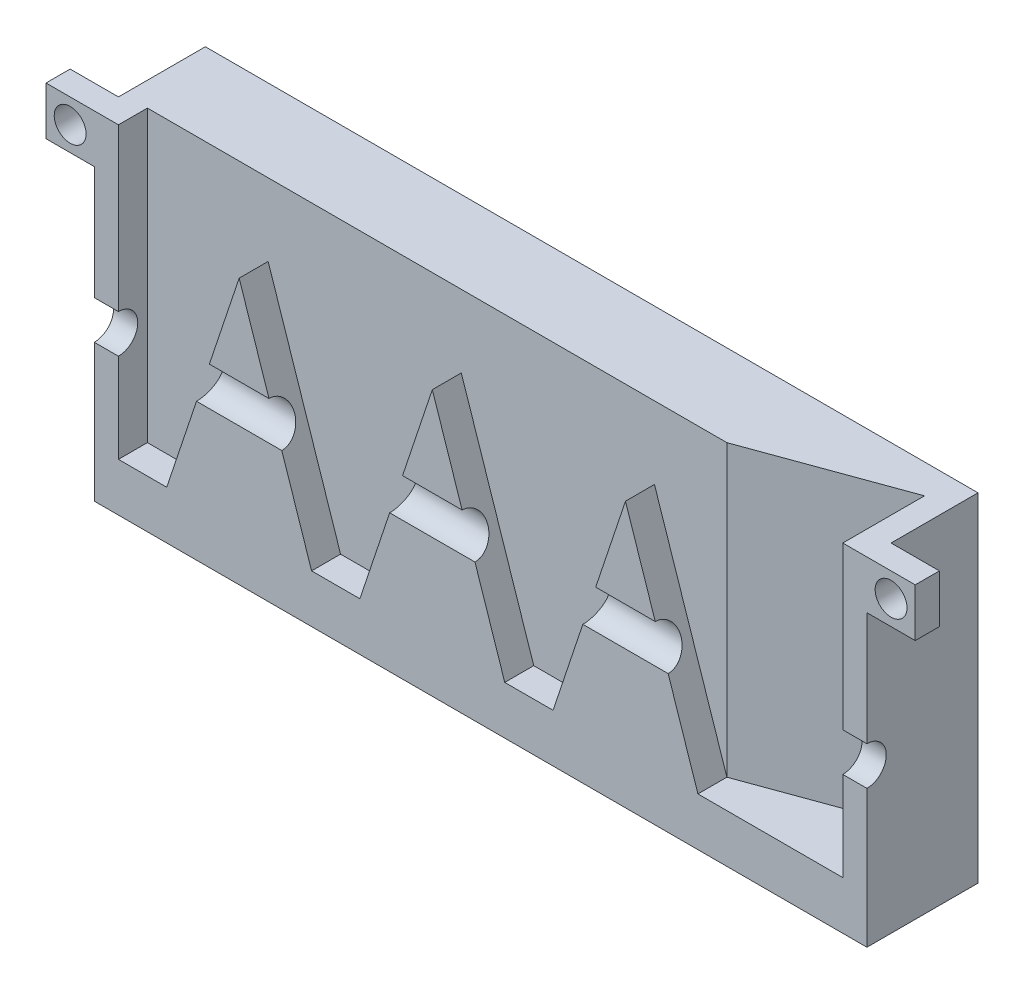
ISO-10303-21;
HEADER;
FILE_DESCRIPTION(('STEP AP214'),'2;1');
FILE_NAME('part.step','',(''),(''),'','','');
FILE_SCHEMA(('AUTOMOTIVE_DESIGN { 1 0 10303 214 1 1 1 1 }'));
ENDSEC;
DATA;
#1=APPLICATION_CONTEXT('core data for automotive mechanical design processes');
#2=APPLICATION_PROTOCOL_DEFINITION('international standard','automotive_design',2000,#1);
#3=PRODUCT_CONTEXT('',#1,'mechanical');
#4=PRODUCT('Part','Part','',(#3));
#5=PRODUCT_RELATED_PRODUCT_CATEGORY('part','',(#4));
#6=PRODUCT_DEFINITION_FORMATION('','',#4);
#7=PRODUCT_DEFINITION_CONTEXT('part definition',#1,'design');
#8=PRODUCT_DEFINITION('design','',#6,#7);
#9=PRODUCT_DEFINITION_SHAPE('','',#8);
#10=(LENGTH_UNIT() NAMED_UNIT(*) SI_UNIT(.MILLI.,.METRE.));
#11=(NAMED_UNIT(*) PLANE_ANGLE_UNIT() SI_UNIT($,.RADIAN.));
#12=(NAMED_UNIT(*) SI_UNIT($,.STERADIAN.) SOLID_ANGLE_UNIT());
#13=UNCERTAINTY_MEASURE_WITH_UNIT(LENGTH_MEASURE(1.E-05),#10,'distance_accuracy_value','');
#14=(GEOMETRIC_REPRESENTATION_CONTEXT(3) GLOBAL_UNCERTAINTY_ASSIGNED_CONTEXT((#13)) GLOBAL_UNIT_ASSIGNED_CONTEXT((#10,
#11,#12)) REPRESENTATION_CONTEXT('',''));
#15=CARTESIAN_POINT('',(0.,0.,0.));
#16=DIRECTION('',(0.,0.,1.));
#17=DIRECTION('',(1.,0.,0.));
#18=AXIS2_PLACEMENT_3D('',#15,#16,#17);
#19=CARTESIAN_POINT('',(0.,0.,63.5515463917525));
#20=DIRECTION('',(0.,0.,-1.));
#21=DIRECTION('',(-1.,0.,0.));
#22=AXIS2_PLACEMENT_3D('',#19,#20,#21);
#23=PLANE('',#22);
#24=DIRECTION('',(0.316227766016838,0.948683298050514,0.));
#25=VECTOR('',#24,1.);
#26=CARTESIAN_POINT('',(-11.6752577319588,5.00000000000001,63.5515463917525));
#27=LINE('',#26,#25);
#28=CARTESIAN_POINT('',(-7.25859106529209,18.25,63.5515463917525));
#29=VERTEX_POINT('',#28);
#30=CARTESIAN_POINT('',(-4.17525773195875,27.5,63.5515463917525));
#31=VERTEX_POINT('',#30);
#32=EDGE_CURVE('E480',#29,#31,#27,.T.);
#33=ORIENTED_EDGE('',*,*,#32,.F.);
#34=DIRECTION('',(-1.,0.,0.));
#35=VECTOR('',#34,1.);
#36=CARTESIAN_POINT('',(45.,18.25,63.5515463917525));
#37=LINE('',#36,#35);
#38=CARTESIAN_POINT('',(-1.09192439862542,18.25,63.5515463917525));
#39=VERTEX_POINT('',#38);
#40=EDGE_CURVE('E452',#29,#39,#37,.F.);
#41=ORIENTED_EDGE('',*,*,#40,.T.);
#42=DIRECTION('',(0.316227766016838,-0.948683298050514,0.));
#43=VECTOR('',#42,1.);
#44=CARTESIAN_POINT('',(-4.17525773195875,27.5,63.5515463917525));
#45=LINE('',#44,#43);
#46=EDGE_CURVE('E466',#31,#39,#45,.T.);
#47=ORIENTED_EDGE('',*,*,#46,.F.);
#48=EDGE_LOOP('',(#33,#41,#47));
#49=FACE_BOUND('',#48,.T.);
#50=ADVANCED_FACE('F32',(#49),#23,.F.);
#51=DIRECTION('',(0.316227766016838,0.948683298050514,0.));
#52=VECTOR('',#51,1.);
#53=CARTESIAN_POINT('',(8.32474226804124,5.00000000000001,63.5515463917525));
#54=LINE('',#53,#52);
#55=CARTESIAN_POINT('',(12.7414089347079,18.25,63.5515463917525));
#56=VERTEX_POINT('',#55);
#57=CARTESIAN_POINT('',(15.8247422680413,27.5,63.5515463917525));
#58=VERTEX_POINT('',#57);
#59=EDGE_CURVE('E455',#56,#58,#54,.T.);
#60=ORIENTED_EDGE('',*,*,#59,.F.);
#61=DIRECTION('',(-1.,0.,0.));
#62=VECTOR('',#61,1.);
#63=CARTESIAN_POINT('',(45.,18.25,63.5515463917525));
#64=LINE('',#63,#62);
#65=CARTESIAN_POINT('',(18.9080756013746,18.25,63.5515463917525));
#66=VERTEX_POINT('',#65);
#67=EDGE_CURVE('E451',#56,#66,#64,.F.);
#68=ORIENTED_EDGE('',*,*,#67,.T.);
#69=DIRECTION('',(0.316227766016838,-0.948683298050514,0.));
#70=VECTOR('',#69,1.);
#71=CARTESIAN_POINT('',(15.8247422680413,27.5,63.5515463917525));
#72=LINE('',#71,#70);
#73=EDGE_CURVE('E436',#58,#66,#72,.T.);
#74=ORIENTED_EDGE('',*,*,#73,.F.);
#75=EDGE_LOOP('',(#60,#68,#74));
#76=FACE_BOUND('',#75,.T.);
#77=ADVANCED_FACE('F654',(#76),#23,.F.);
#78=DIRECTION('',(0.316227766016838,0.948683298050514,0.));
#79=VECTOR('',#78,1.);
#80=CARTESIAN_POINT('',(-31.6752577319588,5.00000000000001,63.5515463917525));
#81=LINE('',#80,#79);
#82=CARTESIAN_POINT('',(-27.2585910652921,18.25,63.5515463917525));
#83=VERTEX_POINT('',#82);
#84=CARTESIAN_POINT('',(-24.1752577319588,27.5,63.5515463917525));
#85=VERTEX_POINT('',#84);
#86=EDGE_CURVE('E438',#83,#85,#81,.T.);
#87=ORIENTED_EDGE('',*,*,#86,.F.);
#88=DIRECTION('',(-1.,0.,0.));
#89=VECTOR('',#88,1.);
#90=CARTESIAN_POINT('',(45.,18.25,63.5515463917525));
#91=LINE('',#90,#89);
#92=CARTESIAN_POINT('',(-21.0919243986254,18.25,63.5515463917525));
#93=VERTEX_POINT('',#92);
#94=EDGE_CURVE('E447',#83,#93,#91,.F.);
#95=ORIENTED_EDGE('',*,*,#94,.T.);
#96=DIRECTION('',(0.316227766016838,-0.948683298050514,0.));
#97=VECTOR('',#96,1.);
#98=CARTESIAN_POINT('',(-24.1752577319588,27.5,63.5515463917525));
#99=LINE('',#98,#97);
#100=EDGE_CURVE('E481',#85,#93,#99,.T.);
#101=ORIENTED_EDGE('',*,*,#100,.F.);
#102=EDGE_LOOP('',(#87,#95,#101));
#103=FACE_BOUND('',#102,.T.);
#104=ADVANCED_FACE('F649',(#103),#23,.F.);
#105=DIRECTION('',(0.,1.,0.));
#106=VECTOR('',#105,1.);
#107=CARTESIAN_POINT('',(-39.1752577319587,35.,63.5515463917525));
#108=LINE('',#107,#106);
#109=CARTESIAN_POINT('',(-39.1752577319587,18.25,63.5515463917525));
#110=VERTEX_POINT('',#109);
#111=CARTESIAN_POINT('',(-39.1752577319587,30.,63.5515463917525));
#112=VERTEX_POINT('',#111);
#113=EDGE_CURVE('E422',#110,#112,#108,.T.);
#114=ORIENTED_EDGE('',*,*,#113,.F.);
#115=DIRECTION('',(-1.,0.,0.));
#116=VECTOR('',#115,1.);
#117=CARTESIAN_POINT('',(45.,18.25,63.5515463917525));
#118=LINE('',#117,#116);
#119=CARTESIAN_POINT('',(-36.6752577319587,18.25,63.5515463917525));
#120=VERTEX_POINT('',#119);
#121=EDGE_CURVE('E414',#110,#120,#118,.F.);
#122=ORIENTED_EDGE('',*,*,#121,.T.);
#123=DIRECTION('',(0.,1.,0.));
#124=VECTOR('',#123,1.);
#125=CARTESIAN_POINT('',(-36.6752577319588,5.00000000000001,63.5515463917525));
#126=LINE('',#125,#124);
#127=CARTESIAN_POINT('',(-36.6752577319588,35.,63.5515463917525));
#128=VERTEX_POINT('',#127);
#129=EDGE_CURVE('E456',#120,#128,#126,.T.);
#130=ORIENTED_EDGE('',*,*,#129,.T.);
#131=DIRECTION('',(1.,0.,0.));
#132=VECTOR('',#131,1.);
#133=CARTESIAN_POINT('',(0.,35.,63.5515463917525));
#134=LINE('',#133,#132);
#135=CARTESIAN_POINT('',(-44.1752577319587,35.,63.5515463917525));
#136=VERTEX_POINT('',#135);
#137=EDGE_CURVE('E420',#136,#128,#134,.T.);
#138=ORIENTED_EDGE('',*,*,#137,.F.);
#139=DIRECTION('',(0.,-1.,0.));
#140=VECTOR('',#139,1.);
#141=CARTESIAN_POINT('',(-44.1752577319587,0.,63.5515463917525));
#142=LINE('',#141,#140);
#143=CARTESIAN_POINT('',(-44.1752577319587,30.,63.5515463917525));
#144=VERTEX_POINT('',#143);
#145=EDGE_CURVE('E432',#136,#144,#142,.T.);
#146=ORIENTED_EDGE('',*,*,#145,.T.);
#147=DIRECTION('',(-1.,0.,0.));
#148=VECTOR('',#147,1.);
#149=CARTESIAN_POINT('',(-44.1752577319587,30.,63.5515463917525));
#150=LINE('',#149,#148);
#151=EDGE_CURVE('E489',#112,#144,#150,.T.);
#152=ORIENTED_EDGE('',*,*,#151,.F.);
#153=EDGE_LOOP('',(#114,#122,#130,#138,#146,#152));
#154=FACE_BOUND('',#153,.T.);
#155=CARTESIAN_POINT('',(-41.6752577319587,32.5,63.5515463917525));
#156=DIRECTION('',(0.,0.,-1.));
#157=DIRECTION('',(-1.,0.,0.));
#158=AXIS2_PLACEMENT_3D('',#155,#156,#157);
#159=CIRCLE('',#158,1.65);
#160=CARTESIAN_POINT('',(-43.3252577319587,32.5,63.5515463917525));
#161=VERTEX_POINT('',#160);
#162=EDGE_CURVE('E36',#161,#161,#159,.F.);
#163=ORIENTED_EDGE('',*,*,#162,.F.);
#164=EDGE_LOOP('',(#163));
#165=FACE_BOUND('',#164,.T.);
#166=ADVANCED_FACE('F629',(#154,#165),#23,.F.);
#167=DIRECTION('',(-1.,0.,0.));
#168=VECTOR('',#167,1.);
#169=CARTESIAN_POINT('',(-36.6752577319588,5.00000000000001,63.5515463917525));
#170=LINE('',#169,#168);
#171=CARTESIAN_POINT('',(-11.6752577319588,5.00000000000001,63.5515463917525));
#172=VERTEX_POINT('',#171);
#173=CARTESIAN_POINT('',(-16.6752577319588,5.00000000000001,63.5515463917525));
#174=VERTEX_POINT('',#173);
#175=EDGE_CURVE('E463',#172,#174,#170,.T.);
#176=ORIENTED_EDGE('',*,*,#175,.T.);
#177=CARTESIAN_POINT('',(-19.7585910652921,14.25,63.5515463917525));
#178=VERTEX_POINT('',#177);
#179=EDGE_CURVE('E471',#178,#174,#99,.T.);
#180=ORIENTED_EDGE('',*,*,#179,.F.);
#181=DIRECTION('',(-1.,0.,0.));
#182=VECTOR('',#181,1.);
#183=CARTESIAN_POINT('',(45.,14.25,63.5515463917525));
#184=LINE('',#183,#182);
#185=CARTESIAN_POINT('',(-28.5919243986254,14.25,63.5515463917525));
#186=VERTEX_POINT('',#185);
#187=EDGE_CURVE('E472',#178,#186,#184,.T.);
#188=ORIENTED_EDGE('',*,*,#187,.T.);
#189=CARTESIAN_POINT('',(-31.6752577319588,5.00000000000001,63.5515463917525));
#190=VERTEX_POINT('',#189);
#191=EDGE_CURVE('E469',#190,#186,#81,.T.);
#192=ORIENTED_EDGE('',*,*,#191,.F.);
#193=DIRECTION('',(-1.,0.,0.));
#194=VECTOR('',#193,1.);
#195=CARTESIAN_POINT('',(-36.6752577319588,5.00000000000001,63.5515463917525));
#196=LINE('',#195,#194);
#197=CARTESIAN_POINT('',(-36.6752577319588,5.00000000000001,63.5515463917525));
#198=VERTEX_POINT('',#197);
#199=EDGE_CURVE('E460',#190,#198,#196,.T.);
#200=ORIENTED_EDGE('',*,*,#199,.T.);
#201=CARTESIAN_POINT('',(-36.6752577319587,14.25,63.5515463917525));
#202=VERTEX_POINT('',#201);
#203=EDGE_CURVE('E459',#198,#202,#126,.T.);
#204=ORIENTED_EDGE('',*,*,#203,.T.);
#205=DIRECTION('',(-1.,0.,0.));
#206=VECTOR('',#205,1.);
#207=CARTESIAN_POINT('',(45.,14.25,63.5515463917525));
#208=LINE('',#207,#206);
#209=CARTESIAN_POINT('',(-39.1752577319587,14.25,63.5515463917525));
#210=VERTEX_POINT('',#209);
#211=EDGE_CURVE('E444',#202,#210,#208,.T.);
#212=ORIENTED_EDGE('',*,*,#211,.T.);
#213=CARTESIAN_POINT('',(-39.1752577319587,0.,63.5515463917525));
#214=VERTEX_POINT('',#213);
#215=EDGE_CURVE('E442',#214,#210,#108,.T.);
#216=ORIENTED_EDGE('',*,*,#215,.F.);
#217=DIRECTION('',(1.,0.,0.));
#218=VECTOR('',#217,1.);
#219=CARTESIAN_POINT('',(0.,0.,63.5515463917525));
#220=LINE('',#219,#218);
#221=CARTESIAN_POINT('',(40.8247422680413,0.,63.5515463917525));
#222=VERTEX_POINT('',#221);
#223=EDGE_CURVE('E424',#214,#222,#220,.T.);
#224=ORIENTED_EDGE('',*,*,#223,.T.);
#225=DIRECTION('',(0.,1.,0.));
#226=VECTOR('',#225,1.);
#227=CARTESIAN_POINT('',(40.8247422680413,35.,63.5515463917525));
#228=LINE('',#227,#226);
#229=CARTESIAN_POINT('',(40.8247422680413,14.25,63.5515463917525));
#230=VERTEX_POINT('',#229);
#231=EDGE_CURVE('E425',#222,#230,#228,.T.);
#232=ORIENTED_EDGE('',*,*,#231,.T.);
#233=DIRECTION('',(-1.,0.,0.));
#234=VECTOR('',#233,1.);
#235=CARTESIAN_POINT('',(45.,14.25,63.5515463917525));
#236=LINE('',#235,#234);
#237=CARTESIAN_POINT('',(38.3247422680412,14.25,63.5515463917525));
#238=VERTEX_POINT('',#237);
#239=EDGE_CURVE('E41',#230,#238,#236,.T.);
#240=ORIENTED_EDGE('',*,*,#239,.T.);
#241=DIRECTION('',(0.,-1.,0.));
#242=VECTOR('',#241,1.);
#243=CARTESIAN_POINT('',(38.3247422680412,5.00000000000001,63.5515463917525));
#244=LINE('',#243,#242);
#245=CARTESIAN_POINT('',(38.3247422680412,5.00000000000001,63.5515463917525));
#246=VERTEX_POINT('',#245);
#247=EDGE_CURVE('E415',#238,#246,#244,.T.);
#248=ORIENTED_EDGE('',*,*,#247,.T.);
#249=DIRECTION('',(-1.,0.,0.));
#250=VECTOR('',#249,1.);
#251=CARTESIAN_POINT('',(-36.6752577319588,5.00000000000001,63.5515463917525));
#252=LINE('',#251,#250);
#253=CARTESIAN_POINT('',(23.3247422680412,5.00000000000001,63.5515463917525));
#254=VERTEX_POINT('',#253);
#255=EDGE_CURVE('E433',#246,#254,#252,.T.);
#256=ORIENTED_EDGE('',*,*,#255,.T.);
#257=CARTESIAN_POINT('',(20.2414089347079,14.25,63.5515463917525));
#258=VERTEX_POINT('',#257);
#259=EDGE_CURVE('E439',#258,#254,#72,.T.);
#260=ORIENTED_EDGE('',*,*,#259,.F.);
#261=DIRECTION('',(-1.,0.,0.));
#262=VECTOR('',#261,1.);
#263=CARTESIAN_POINT('',(45.,14.25,63.5515463917525));
#264=LINE('',#263,#262);
#265=CARTESIAN_POINT('',(11.4080756013746,14.25,63.5515463917525));
#266=VERTEX_POINT('',#265);
#267=EDGE_CURVE('E448',#258,#266,#264,.T.);
#268=ORIENTED_EDGE('',*,*,#267,.T.);
#269=CARTESIAN_POINT('',(8.32474226804124,5.00000000000001,63.5515463917525));
#270=VERTEX_POINT('',#269);
#271=EDGE_CURVE('E453',#270,#266,#54,.T.);
#272=ORIENTED_EDGE('',*,*,#271,.F.);
#273=DIRECTION('',(-1.,0.,0.));
#274=VECTOR('',#273,1.);
#275=CARTESIAN_POINT('',(-36.6752577319588,5.00000000000001,63.5515463917525));
#276=LINE('',#275,#274);
#277=CARTESIAN_POINT('',(3.32474226804125,5.00000000000001,63.5515463917525));
#278=VERTEX_POINT('',#277);
#279=EDGE_CURVE('E418',#270,#278,#276,.T.);
#280=ORIENTED_EDGE('',*,*,#279,.T.);
#281=CARTESIAN_POINT('',(0.241408934707921,14.25,63.5515463917525));
#282=VERTEX_POINT('',#281);
#283=EDGE_CURVE('E468',#282,#278,#45,.T.);
#284=ORIENTED_EDGE('',*,*,#283,.F.);
#285=DIRECTION('',(-1.,0.,0.));
#286=VECTOR('',#285,1.);
#287=CARTESIAN_POINT('',(45.,14.25,63.5515463917525));
#288=LINE('',#287,#286);
#289=CARTESIAN_POINT('',(-8.59192439862543,14.25,63.5515463917525));
#290=VERTEX_POINT('',#289);
#291=EDGE_CURVE('E475',#282,#290,#288,.T.);
#292=ORIENTED_EDGE('',*,*,#291,.T.);
#293=EDGE_CURVE('E478',#172,#290,#27,.T.);
#294=ORIENTED_EDGE('',*,*,#293,.F.);
#295=EDGE_LOOP('',(#176,#180,#188,#192,#200,#204,#212,#216,#224,#232,#240,#248,#256,#260,#268,
#272,#280,#284,#292,#294));
#296=FACE_BOUND('',#295,.T.);
#297=ADVANCED_FACE('F548',(#296),#23,.F.);
#298=CARTESIAN_POINT('',(43.3247422680413,32.5,63.5515463917525));
#299=DIRECTION('',(0.,0.,-1.));
#300=DIRECTION('',(-1.,0.,0.));
#301=AXIS2_PLACEMENT_3D('',#298,#299,#300);
#302=CIRCLE('',#301,1.65);
#303=CARTESIAN_POINT('',(41.6747422680413,32.5,63.5515463917525));
#304=VERTEX_POINT('',#303);
#305=EDGE_CURVE('E428',#304,#304,#302,.T.);
#306=ORIENTED_EDGE('',*,*,#305,.T.);
#307=EDGE_LOOP('',(#306));
#308=FACE_BOUND('',#307,.T.);
#309=DIRECTION('',(1.,0.,0.));
#310=VECTOR('',#309,1.);
#311=CARTESIAN_POINT('',(45.8247422680413,30.,63.5515463917525));
#312=LINE('',#311,#310);
#313=CARTESIAN_POINT('',(40.8247422680413,30.,63.5515463917525));
#314=VERTEX_POINT('',#313);
#315=CARTESIAN_POINT('',(45.8247422680413,30.,63.5515463917525));
#316=VERTEX_POINT('',#315);
#317=EDGE_CURVE('E429',#314,#316,#312,.T.);
#318=ORIENTED_EDGE('',*,*,#317,.T.);
#319=DIRECTION('',(0.,1.,0.));
#320=VECTOR('',#319,1.);
#321=CARTESIAN_POINT('',(45.8247422680413,0.,63.5515463917525));
#322=LINE('',#321,#320);
#323=CARTESIAN_POINT('',(45.8247422680413,35.,63.5515463917525));
#324=VERTEX_POINT('',#323);
#325=EDGE_CURVE('E426',#316,#324,#322,.T.);
#326=ORIENTED_EDGE('',*,*,#325,.T.);
#327=CARTESIAN_POINT('',(38.3247422680412,35.,63.5515463917525));
#328=VERTEX_POINT('',#327);
#329=EDGE_CURVE('E261',#328,#324,#134,.T.);
#330=ORIENTED_EDGE('',*,*,#329,.F.);
#331=CARTESIAN_POINT('',(38.3247422680412,18.25,63.5515463917525));
#332=VERTEX_POINT('',#331);
#333=EDGE_CURVE('E419',#328,#332,#244,.T.);
#334=ORIENTED_EDGE('',*,*,#333,.T.);
#335=DIRECTION('',(-1.,0.,0.));
#336=VECTOR('',#335,1.);
#337=CARTESIAN_POINT('',(45.,18.25,63.5515463917525));
#338=LINE('',#337,#336);
#339=CARTESIAN_POINT('',(40.8247422680413,18.25,63.5515463917525));
#340=VERTEX_POINT('',#339);
#341=EDGE_CURVE('E11',#332,#340,#338,.F.);
#342=ORIENTED_EDGE('',*,*,#341,.T.);
#343=EDGE_CURVE('E56',#340,#314,#228,.T.);
#344=ORIENTED_EDGE('',*,*,#343,.T.);
#345=EDGE_LOOP('',(#318,#326,#330,#334,#342,#344));
#346=FACE_BOUND('',#345,.T.);
#347=ADVANCED_FACE('F34',(#308,#346),#23,.F.);
#348=CARTESIAN_POINT('',(40.8247422680413,35.,52.0515463917525));
#349=DIRECTION('',(1.,0.,0.));
#350=DIRECTION('',(0.,0.,-1.));
#351=AXIS2_PLACEMENT_3D('',#348,#349,#350);
#352=PLANE('',#351);
#353=ORIENTED_EDGE('',*,*,#231,.F.);
#354=DIRECTION('',(0.,0.,1.));
#355=VECTOR('',#354,1.);
#356=CARTESIAN_POINT('',(40.8247422680413,0.,52.0515463917525));
#357=LINE('',#356,#355);
#358=CARTESIAN_POINT('',(40.8247422680413,0.,52.0515463917525));
#359=VERTEX_POINT('',#358);
#360=EDGE_CURVE('E401',#359,#222,#357,.T.);
#361=ORIENTED_EDGE('',*,*,#360,.F.);
#362=DIRECTION('',(0.,-1.,0.));
#363=VECTOR('',#362,1.);
#364=CARTESIAN_POINT('',(40.8247422680413,35.,52.0515463917525));
#365=LINE('',#364,#363);
#366=CARTESIAN_POINT('',(40.8247422680413,35.,52.0515463917525));
#367=VERTEX_POINT('',#366);
#368=EDGE_CURVE('E398',#367,#359,#365,.T.);
#369=ORIENTED_EDGE('',*,*,#368,.F.);
#370=DIRECTION('',(0.,0.,1.));
#371=VECTOR('',#370,1.);
#372=CARTESIAN_POINT('',(40.8247422680413,35.,52.0515463917525));
#373=LINE('',#372,#371);
#374=CARTESIAN_POINT('',(40.8247422680413,35.,61.0515463917525));
#375=VERTEX_POINT('',#374);
#376=EDGE_CURVE('E392',#367,#375,#373,.T.);
#377=ORIENTED_EDGE('',*,*,#376,.T.);
#378=DIRECTION('',(0.,-1.,0.));
#379=VECTOR('',#378,1.);
#380=CARTESIAN_POINT('',(40.8247422680413,35.,61.0515463917525));
#381=LINE('',#380,#379);
#382=CARTESIAN_POINT('',(40.8247422680413,30.,61.0515463917525));
#383=VERTEX_POINT('',#382);
#384=EDGE_CURVE('E273',#375,#383,#381,.T.);
#385=ORIENTED_EDGE('',*,*,#384,.T.);
#386=DIRECTION('',(0.,0.,1.));
#387=VECTOR('',#386,1.);
#388=CARTESIAN_POINT('',(40.8247422680413,30.,61.0515463917525));
#389=LINE('',#388,#387);
#390=EDGE_CURVE('E280',#383,#314,#389,.T.);
#391=ORIENTED_EDGE('',*,*,#390,.T.);
#392=ORIENTED_EDGE('',*,*,#343,.F.);
#393=CARTESIAN_POINT('',(40.8247422680413,16.25,63.5515463917525));
#394=DIRECTION('',(1.,0.,0.));
#395=DIRECTION('',(0.,0.,-1.));
#396=AXIS2_PLACEMENT_3D('',#393,#394,#395);
#397=CIRCLE('',#396,2.);
#398=EDGE_CURVE('E509',#340,#230,#397,.F.);
#399=ORIENTED_EDGE('',*,*,#398,.T.);
#400=EDGE_LOOP('',(#353,#361,#369,#377,#385,#391,#392,#399));
#401=FACE_BOUND('',#400,.T.);
#402=ADVANCED_FACE('F600',(#401),#352,.T.);
#403=CARTESIAN_POINT('',(-39.1752577319587,35.,52.0515463917525));
#404=DIRECTION('',(1.,0.,0.));
#405=DIRECTION('',(0.,0.,-1.));
#406=AXIS2_PLACEMENT_3D('',#403,#404,#405);
#407=PLANE('',#406);
#408=DIRECTION('',(0.,0.,1.));
#409=VECTOR('',#408,1.);
#410=CARTESIAN_POINT('',(-39.1752577319587,0.,52.0515463917525));
#411=LINE('',#410,#409);
#412=CARTESIAN_POINT('',(-39.1752577319587,0.,52.0515463917525));
#413=VERTEX_POINT('',#412);
#414=EDGE_CURVE('E393',#413,#214,#411,.T.);
#415=ORIENTED_EDGE('',*,*,#414,.T.);
#416=ORIENTED_EDGE('',*,*,#215,.T.);
#417=CARTESIAN_POINT('',(-39.1752577319587,16.25,63.5515463917525));
#418=DIRECTION('',(1.,0.,0.));
#419=DIRECTION('',(0.,0.,-1.));
#420=AXIS2_PLACEMENT_3D('',#417,#418,#419);
#421=CIRCLE('',#420,2.);
#422=EDGE_CURVE('E510',#110,#210,#421,.F.);
#423=ORIENTED_EDGE('',*,*,#422,.F.);
#424=ORIENTED_EDGE('',*,*,#113,.T.);
#425=DIRECTION('',(0.,0.,1.));
#426=VECTOR('',#425,1.);
#427=CARTESIAN_POINT('',(-39.1752577319587,30.,61.0515463917525));
#428=LINE('',#427,#426);
#429=CARTESIAN_POINT('',(-39.1752577319587,30.,61.0515463917525));
#430=VERTEX_POINT('',#429);
#431=EDGE_CURVE('E297',#430,#112,#428,.T.);
#432=ORIENTED_EDGE('',*,*,#431,.F.);
#433=DIRECTION('',(0.,-1.,0.));
#434=VECTOR('',#433,1.);
#435=CARTESIAN_POINT('',(-39.1752577319587,35.,61.0515463917525));
#436=LINE('',#435,#434);
#437=CARTESIAN_POINT('',(-39.1752577319587,35.,61.0515463917525));
#438=VERTEX_POINT('',#437);
#439=EDGE_CURVE('E292',#438,#430,#436,.T.);
#440=ORIENTED_EDGE('',*,*,#439,.F.);
#441=DIRECTION('',(0.,0.,1.));
#442=VECTOR('',#441,1.);
#443=CARTESIAN_POINT('',(-39.1752577319587,35.,52.0515463917525));
#444=LINE('',#443,#442);
#445=CARTESIAN_POINT('',(-39.1752577319587,35.,52.0515463917525));
#446=VERTEX_POINT('',#445);
#447=EDGE_CURVE('E395',#446,#438,#444,.T.);
#448=ORIENTED_EDGE('',*,*,#447,.F.);
#449=DIRECTION('',(0.,-1.,0.));
#450=VECTOR('',#449,1.);
#451=CARTESIAN_POINT('',(-39.1752577319587,35.,52.0515463917525));
#452=LINE('',#451,#450);
#453=EDGE_CURVE('E406',#446,#413,#452,.T.);
#454=ORIENTED_EDGE('',*,*,#453,.T.);
#455=EDGE_LOOP('',(#415,#416,#423,#424,#432,#440,#448,#454));
#456=FACE_BOUND('',#455,.T.);
#457=ADVANCED_FACE('F591',(#456),#407,.F.);
#458=CARTESIAN_POINT('',(-39.1752577319587,35.,52.0515463917525));
#459=DIRECTION('',(0.,0.,-1.));
#460=DIRECTION('',(-1.,0.,0.));
#461=AXIS2_PLACEMENT_3D('',#458,#459,#460);
#462=PLANE('',#461);
#463=DIRECTION('',(1.,0.,0.));
#464=VECTOR('',#463,1.);
#465=CARTESIAN_POINT('',(-39.1752577319587,0.,52.0515463917525));
#466=LINE('',#465,#464);
#467=EDGE_CURVE('E388',#413,#359,#466,.T.);
#468=ORIENTED_EDGE('',*,*,#467,.F.);
#469=ORIENTED_EDGE('',*,*,#453,.F.);
#470=DIRECTION('',(1.,0.,0.));
#471=VECTOR('',#470,1.);
#472=CARTESIAN_POINT('',(-39.1752577319587,35.,52.0515463917525));
#473=LINE('',#472,#471);
#474=EDGE_CURVE('E389',#446,#367,#473,.T.);
#475=ORIENTED_EDGE('',*,*,#474,.T.);
#476=ORIENTED_EDGE('',*,*,#368,.T.);
#477=EDGE_LOOP('',(#468,#469,#475,#476));
#478=FACE_BOUND('',#477,.T.);
#479=ADVANCED_FACE('F597',(#478),#462,.T.);
#480=CARTESIAN_POINT('',(0.,35.,0.));
#481=DIRECTION('',(0.,-1.,0.));
#482=DIRECTION('',(0.,0.,-1.));
#483=AXIS2_PLACEMENT_3D('',#480,#481,#482);
#484=PLANE('',#483);
#485=DIRECTION('',(0.,0.,-1.));
#486=VECTOR('',#485,1.);
#487=CARTESIAN_POINT('',(-44.1752577319587,35.,61.0515463917525));
#488=LINE('',#487,#486);
#489=CARTESIAN_POINT('',(-44.1752577319587,35.,61.0515463917525));
#490=VERTEX_POINT('',#489);
#491=EDGE_CURVE('E300',#136,#490,#488,.T.);
#492=ORIENTED_EDGE('',*,*,#491,.F.);
#493=ORIENTED_EDGE('',*,*,#137,.T.);
#494=DIRECTION('',(0.,0.,1.));
#495=VECTOR('',#494,1.);
#496=CARTESIAN_POINT('',(-36.6752577319588,35.,60.5515463917525));
#497=LINE('',#496,#495);
#498=CARTESIAN_POINT('',(-36.6752577319588,35.,60.5515463917525));
#499=VERTEX_POINT('',#498);
#500=EDGE_CURVE('E382',#499,#128,#497,.T.);
#501=ORIENTED_EDGE('',*,*,#500,.F.);
#502=DIRECTION('',(1.,0.,0.));
#503=VECTOR('',#502,1.);
#504=CARTESIAN_POINT('',(-36.6752577319588,35.,60.5515463917525));
#505=LINE('',#504,#503);
#506=CARTESIAN_POINT('',(23.3247422680413,35.,60.5515463917525));
#507=VERTEX_POINT('',#506);
#508=EDGE_CURVE('E374',#499,#507,#505,.T.);
#509=ORIENTED_EDGE('',*,*,#508,.T.);
#510=DIRECTION('',(0.93969262078591,0.,-0.342020143325663));
#511=VECTOR('',#510,1.);
#512=CARTESIAN_POINT('',(23.3247422680413,35.,60.5515463917525));
#513=LINE('',#512,#511);
#514=CARTESIAN_POINT('',(38.3247422680412,35.,55.0919928777596));
#515=VERTEX_POINT('',#514);
#516=EDGE_CURVE('E320',#507,#515,#513,.T.);
#517=ORIENTED_EDGE('',*,*,#516,.T.);
#518=DIRECTION('',(0.,0.,1.));
#519=VECTOR('',#518,1.);
#520=CARTESIAN_POINT('',(38.3247422680412,35.,60.5515463917525));
#521=LINE('',#520,#519);
#522=EDGE_CURVE('E380',#515,#328,#521,.T.);
#523=ORIENTED_EDGE('',*,*,#522,.T.);
#524=ORIENTED_EDGE('',*,*,#329,.T.);
#525=DIRECTION('',(0.,0.,-1.));
#526=VECTOR('',#525,1.);
#527=CARTESIAN_POINT('',(45.8247422680413,35.,61.0515463917525));
#528=LINE('',#527,#526);
#529=CARTESIAN_POINT('',(45.8247422680413,35.,61.0515463917525));
#530=VERTEX_POINT('',#529);
#531=EDGE_CURVE('E252',#324,#530,#528,.T.);
#532=ORIENTED_EDGE('',*,*,#531,.T.);
#533=DIRECTION('',(-1.,0.,0.));
#534=VECTOR('',#533,1.);
#535=CARTESIAN_POINT('',(45.8247422680413,35.,61.0515463917525));
#536=LINE('',#535,#534);
#537=EDGE_CURVE('E257',#530,#375,#536,.T.);
#538=ORIENTED_EDGE('',*,*,#537,.T.);
#539=ORIENTED_EDGE('',*,*,#376,.F.);
#540=ORIENTED_EDGE('',*,*,#474,.F.);
#541=ORIENTED_EDGE('',*,*,#447,.T.);
#542=DIRECTION('',(1.,0.,0.));
#543=VECTOR('',#542,1.);
#544=CARTESIAN_POINT('',(-44.1752577319587,35.,61.0515463917525));
#545=LINE('',#544,#543);
#546=EDGE_CURVE('E302',#490,#438,#545,.T.);
#547=ORIENTED_EDGE('',*,*,#546,.F.);
#548=EDGE_LOOP('',(#492,#493,#501,#509,#517,#523,#524,#532,#538,#539,#540,#541,#547));
#549=FACE_BOUND('',#548,.T.);
#550=ADVANCED_FACE('F255',(#549),#484,.F.);
#551=CARTESIAN_POINT('',(0.,0.,0.));
#552=DIRECTION('',(0.,-1.,0.));
#553=DIRECTION('',(0.,0.,-1.));
#554=AXIS2_PLACEMENT_3D('',#551,#552,#553);
#555=PLANE('',#554);
#556=ORIENTED_EDGE('',*,*,#223,.F.);
#557=ORIENTED_EDGE('',*,*,#414,.F.);
#558=ORIENTED_EDGE('',*,*,#467,.T.);
#559=ORIENTED_EDGE('',*,*,#360,.T.);
#560=EDGE_LOOP('',(#556,#557,#558,#559));
#561=FACE_BOUND('',#560,.T.);
#562=ADVANCED_FACE('F595',(#561),#555,.T.);
#563=CARTESIAN_POINT('',(-36.6752577319588,5.00000000000001,60.5515463917525));
#564=DIRECTION('',(0.,1.,0.));
#565=DIRECTION('',(1.,0.,0.));
#566=AXIS2_PLACEMENT_3D('',#563,#564,#565);
#567=PLANE('',#566);
#568=ORIENTED_EDGE('',*,*,#255,.F.);
#569=DIRECTION('',(0.,0.,1.));
#570=VECTOR('',#569,1.);
#571=CARTESIAN_POINT('',(38.3247422680412,5.00000000000001,60.5515463917525));
#572=LINE('',#571,#570);
#573=CARTESIAN_POINT('',(38.3247422680412,5.00000000000001,55.0919928777596));
#574=VERTEX_POINT('',#573);
#575=EDGE_CURVE('E377',#574,#246,#572,.T.);
#576=ORIENTED_EDGE('',*,*,#575,.F.);
#577=DIRECTION('',(-0.93969262078591,0.,0.342020143325663));
#578=VECTOR('',#577,1.);
#579=CARTESIAN_POINT('',(23.3247422680413,5.00000000000001,60.5515463917525));
#580=LINE('',#579,#578);
#581=CARTESIAN_POINT('',(23.3247422680413,5.00000000000001,60.5515463917525));
#582=VERTEX_POINT('',#581);
#583=EDGE_CURVE('E312',#574,#582,#580,.T.);
#584=ORIENTED_EDGE('',*,*,#583,.T.);
#585=DIRECTION('',(0.,0.,1.));
#586=VECTOR('',#585,1.);
#587=CARTESIAN_POINT('',(23.3247422680412,5.00000000000001,33.5099118257726));
#588=LINE('',#587,#586);
#589=EDGE_CURVE('E323',#582,#254,#588,.T.);
#590=ORIENTED_EDGE('',*,*,#589,.T.);
#591=EDGE_LOOP('',(#568,#576,#584,#590));
#592=FACE_BOUND('',#591,.T.);
#593=ADVANCED_FACE('F608',(#592),#567,.T.);
#594=CARTESIAN_POINT('',(38.3247422680412,5.00000000000001,60.5515463917525));
#595=DIRECTION('',(-1.,0.,0.));
#596=DIRECTION('',(0.,1.,0.));
#597=AXIS2_PLACEMENT_3D('',#594,#595,#596);
#598=PLANE('',#597);
#599=ORIENTED_EDGE('',*,*,#333,.F.);
#600=ORIENTED_EDGE('',*,*,#522,.F.);
#601=DIRECTION('',(0.,-1.,0.));
#602=VECTOR('',#601,1.);
#603=CARTESIAN_POINT('',(38.3247422680412,50.9626665871387,55.0919928777596));
#604=LINE('',#603,#602);
#605=EDGE_CURVE('E317',#515,#574,#604,.T.);
#606=ORIENTED_EDGE('',*,*,#605,.T.);
#607=ORIENTED_EDGE('',*,*,#575,.T.);
#608=ORIENTED_EDGE('',*,*,#247,.F.);
#609=CARTESIAN_POINT('',(38.3247422680412,16.25,63.5515463917525));
#610=DIRECTION('',(-1.,0.,0.));
#611=DIRECTION('',(0.,0.,1.));
#612=AXIS2_PLACEMENT_3D('',#609,#610,#611);
#613=CIRCLE('',#612,2.);
#614=EDGE_CURVE('E512',#238,#332,#613,.F.);
#615=ORIENTED_EDGE('',*,*,#614,.T.);
#616=EDGE_LOOP('',(#599,#600,#606,#607,#608,#615));
#617=FACE_BOUND('',#616,.T.);
#618=ADVANCED_FACE('F604',(#617),#598,.T.);
#619=ORIENTED_EDGE('',*,*,#279,.F.);
#620=DIRECTION('',(0.,0.,1.));
#621=VECTOR('',#620,1.);
#622=CARTESIAN_POINT('',(8.32474226804124,5.00000000000001,33.5099118257726));
#623=LINE('',#622,#621);
#624=CARTESIAN_POINT('',(8.32474226804124,5.00000000000001,60.5515463917525));
#625=VERTEX_POINT('',#624);
#626=EDGE_CURVE('E349',#625,#270,#623,.T.);
#627=ORIENTED_EDGE('',*,*,#626,.F.);
#628=DIRECTION('',(-1.,0.,0.));
#629=VECTOR('',#628,1.);
#630=CARTESIAN_POINT('',(-36.6752577319588,5.00000000000001,60.5515463917525));
#631=LINE('',#630,#629);
#632=CARTESIAN_POINT('',(3.32474226804125,5.00000000000001,60.5515463917525));
#633=VERTEX_POINT('',#632);
#634=EDGE_CURVE('E371',#625,#633,#631,.T.);
#635=ORIENTED_EDGE('',*,*,#634,.T.);
#636=DIRECTION('',(0.,0.,1.));
#637=VECTOR('',#636,1.);
#638=CARTESIAN_POINT('',(3.32474226804125,5.00000000000001,33.5099118257726));
#639=LINE('',#638,#637);
#640=EDGE_CURVE('E329',#633,#278,#639,.T.);
#641=ORIENTED_EDGE('',*,*,#640,.T.);
#642=EDGE_LOOP('',(#619,#627,#635,#641));
#643=FACE_BOUND('',#642,.T.);
#644=ADVANCED_FACE('F552',(#643),#567,.T.);
#645=ORIENTED_EDGE('',*,*,#175,.F.);
#646=DIRECTION('',(0.,0.,1.));
#647=VECTOR('',#646,1.);
#648=CARTESIAN_POINT('',(-11.6752577319588,5.00000000000001,33.5099118257726));
#649=LINE('',#648,#647);
#650=CARTESIAN_POINT('',(-11.6752577319588,5.00000000000001,60.5515463917525));
#651=VERTEX_POINT('',#650);
#652=EDGE_CURVE('E336',#651,#172,#649,.T.);
#653=ORIENTED_EDGE('',*,*,#652,.F.);
#654=CARTESIAN_POINT('',(-16.6752577319588,5.00000000000001,60.5515463917525));
#655=VERTEX_POINT('',#654);
#656=EDGE_CURVE('E369',#651,#655,#631,.T.);
#657=ORIENTED_EDGE('',*,*,#656,.T.);
#658=DIRECTION('',(0.,0.,1.));
#659=VECTOR('',#658,1.);
#660=CARTESIAN_POINT('',(-16.6752577319588,5.00000000000001,33.5099118257726));
#661=LINE('',#660,#659);
#662=EDGE_CURVE('E327',#655,#174,#661,.T.);
#663=ORIENTED_EDGE('',*,*,#662,.T.);
#664=EDGE_LOOP('',(#645,#653,#657,#663));
#665=FACE_BOUND('',#664,.T.);
#666=ADVANCED_FACE('F561',(#665),#567,.T.);
#667=CARTESIAN_POINT('',(-36.6752577319588,5.00000000000001,60.5515463917525));
#668=DIRECTION('',(0.,0.,1.));
#669=DIRECTION('',(1.,0.,0.));
#670=AXIS2_PLACEMENT_3D('',#667,#668,#669);
#671=PLANE('',#670);
#672=ORIENTED_EDGE('',*,*,#508,.F.);
#673=DIRECTION('',(0.,1.,0.));
#674=VECTOR('',#673,1.);
#675=CARTESIAN_POINT('',(-36.6752577319588,5.00000000000001,60.5515463917525));
#676=LINE('',#675,#674);
#677=CARTESIAN_POINT('',(-36.6752577319588,5.00000000000001,60.5515463917525));
#678=VERTEX_POINT('',#677);
#679=EDGE_CURVE('E372',#678,#499,#676,.T.);
#680=ORIENTED_EDGE('',*,*,#679,.F.);
#681=CARTESIAN_POINT('',(-31.6752577319588,5.00000000000001,60.5515463917525));
#682=VERTEX_POINT('',#681);
#683=EDGE_CURVE('E357',#682,#678,#631,.T.);
#684=ORIENTED_EDGE('',*,*,#683,.F.);
#685=DIRECTION('',(-0.316227766016838,-0.948683298050514,0.));
#686=VECTOR('',#685,1.);
#687=CARTESIAN_POINT('',(-31.6752577319588,5.00000000000001,60.5515463917525));
#688=LINE('',#687,#686);
#689=CARTESIAN_POINT('',(-24.1752577319588,27.5,60.5515463917525));
#690=VERTEX_POINT('',#689);
#691=EDGE_CURVE('E354',#690,#682,#688,.T.);
#692=ORIENTED_EDGE('',*,*,#691,.F.);
#693=DIRECTION('',(-0.316227766016838,0.948683298050514,0.));
#694=VECTOR('',#693,1.);
#695=CARTESIAN_POINT('',(-24.1752577319588,27.5,60.5515463917525));
#696=LINE('',#695,#694);
#697=EDGE_CURVE('E358',#655,#690,#696,.T.);
#698=ORIENTED_EDGE('',*,*,#697,.F.);
#699=ORIENTED_EDGE('',*,*,#656,.F.);
#700=DIRECTION('',(-0.316227766016838,-0.948683298050514,0.));
#701=VECTOR('',#700,1.);
#702=CARTESIAN_POINT('',(-11.6752577319588,5.00000000000001,60.5515463917525));
#703=LINE('',#702,#701);
#704=CARTESIAN_POINT('',(-4.17525773195875,27.5,60.5515463917525));
#705=VERTEX_POINT('',#704);
#706=EDGE_CURVE('E324',#705,#651,#703,.T.);
#707=ORIENTED_EDGE('',*,*,#706,.F.);
#708=DIRECTION('',(-0.316227766016838,0.948683298050514,0.));
#709=VECTOR('',#708,1.);
#710=CARTESIAN_POINT('',(-4.17525773195875,27.5,60.5515463917525));
#711=LINE('',#710,#709);
#712=EDGE_CURVE('E328',#633,#705,#711,.T.);
#713=ORIENTED_EDGE('',*,*,#712,.F.);
#714=ORIENTED_EDGE('',*,*,#634,.F.);
#715=DIRECTION('',(-0.316227766016838,-0.948683298050514,0.));
#716=VECTOR('',#715,1.);
#717=CARTESIAN_POINT('',(8.32474226804124,5.00000000000001,60.5515463917525));
#718=LINE('',#717,#716);
#719=CARTESIAN_POINT('',(15.8247422680413,27.5,60.5515463917525));
#720=VERTEX_POINT('',#719);
#721=EDGE_CURVE('E333',#720,#625,#718,.T.);
#722=ORIENTED_EDGE('',*,*,#721,.F.);
#723=DIRECTION('',(-0.316227766016838,0.948683298050514,0.));
#724=VECTOR('',#723,1.);
#725=CARTESIAN_POINT('',(15.8247422680413,27.5,60.5515463917525));
#726=LINE('',#725,#724);
#727=EDGE_CURVE('E343',#582,#720,#726,.T.);
#728=ORIENTED_EDGE('',*,*,#727,.F.);
#729=DIRECTION('',(0.,-1.,0.));
#730=VECTOR('',#729,1.);
#731=CARTESIAN_POINT('',(23.3247422680413,50.9626665871387,60.5515463917525));
#732=LINE('',#731,#730);
#733=EDGE_CURVE('E314',#507,#582,#732,.T.);
#734=ORIENTED_EDGE('',*,*,#733,.F.);
#735=EDGE_LOOP('',(#672,#680,#684,#692,#698,#699,#707,#713,#714,#722,#728,#734));
#736=FACE_BOUND('',#735,.T.);
#737=ADVANCED_FACE('F556',(#736),#671,.T.);
#738=ORIENTED_EDGE('',*,*,#199,.F.);
#739=DIRECTION('',(0.,0.,1.));
#740=VECTOR('',#739,1.);
#741=CARTESIAN_POINT('',(-31.6752577319588,5.00000000000001,33.5099118257726));
#742=LINE('',#741,#740);
#743=EDGE_CURVE('E364',#682,#190,#742,.T.);
#744=ORIENTED_EDGE('',*,*,#743,.F.);
#745=ORIENTED_EDGE('',*,*,#683,.T.);
#746=DIRECTION('',(0.,0.,1.));
#747=VECTOR('',#746,1.);
#748=CARTESIAN_POINT('',(-36.6752577319588,5.00000000000001,60.5515463917525));
#749=LINE('',#748,#747);
#750=EDGE_CURVE('E385',#678,#198,#749,.T.);
#751=ORIENTED_EDGE('',*,*,#750,.T.);
#752=EDGE_LOOP('',(#738,#744,#745,#751));
#753=FACE_BOUND('',#752,.T.);
#754=ADVANCED_FACE('F578',(#753),#567,.T.);
#755=CARTESIAN_POINT('',(-36.6752577319588,5.00000000000001,60.5515463917525));
#756=DIRECTION('',(1.,0.,0.));
#757=DIRECTION('',(0.,-1.,0.));
#758=AXIS2_PLACEMENT_3D('',#755,#756,#757);
#759=PLANE('',#758);
#760=ORIENTED_EDGE('',*,*,#203,.F.);
#761=ORIENTED_EDGE('',*,*,#750,.F.);
#762=ORIENTED_EDGE('',*,*,#679,.T.);
#763=ORIENTED_EDGE('',*,*,#500,.T.);
#764=ORIENTED_EDGE('',*,*,#129,.F.);
#765=CARTESIAN_POINT('',(-36.6752577319587,16.25,63.5515463917525));
#766=DIRECTION('',(1.,0.,0.));
#767=DIRECTION('',(0.,0.,-1.));
#768=AXIS2_PLACEMENT_3D('',#765,#766,#767);
#769=CIRCLE('',#768,2.);
#770=EDGE_CURVE('E517',#120,#202,#769,.F.);
#771=ORIENTED_EDGE('',*,*,#770,.T.);
#772=EDGE_LOOP('',(#760,#761,#762,#763,#764,#771));
#773=FACE_BOUND('',#772,.T.);
#774=ADVANCED_FACE('F582',(#773),#759,.T.);
#775=CARTESIAN_POINT('',(-24.1752577319588,27.5,33.5099118257726));
#776=DIRECTION('',(-0.948683298050514,-0.316227766016838,0.));
#777=DIRECTION('',(-0.316227766016838,0.948683298050514,0.));
#778=AXIS2_PLACEMENT_3D('',#775,#776,#777);
#779=PLANE('',#778);
#780=DIRECTION('',(0.,0.,1.));
#781=VECTOR('',#780,1.);
#782=CARTESIAN_POINT('',(-24.1752577319588,27.5,33.5099118257726));
#783=LINE('',#782,#781);
#784=EDGE_CURVE('E361',#690,#85,#783,.T.);
#785=ORIENTED_EDGE('',*,*,#784,.T.);
#786=ORIENTED_EDGE('',*,*,#100,.T.);
#787=CARTESIAN_POINT('',(-20.4252577319587,16.25,63.5515463917525));
#788=DIRECTION('',(-0.948683298050514,-0.316227766016838,0.));
#789=DIRECTION('',(-0.316227766016838,0.948683298050514,0.));
#790=AXIS2_PLACEMENT_3D('',#787,#788,#789);
#791=ELLIPSE('',#790,2.10818510677892,2.);
#792=EDGE_CURVE('E520',#178,#93,#791,.F.);
#793=ORIENTED_EDGE('',*,*,#792,.F.);
#794=ORIENTED_EDGE('',*,*,#179,.T.);
#795=ORIENTED_EDGE('',*,*,#662,.F.);
#796=ORIENTED_EDGE('',*,*,#697,.T.);
#797=EDGE_LOOP('',(#785,#786,#793,#794,#795,#796));
#798=FACE_BOUND('',#797,.T.);
#799=ADVANCED_FACE('F566',(#798),#779,.F.);
#800=CARTESIAN_POINT('',(-31.6752577319588,5.00000000000001,33.5099118257726));
#801=DIRECTION('',(0.948683298050514,-0.316227766016838,0.));
#802=DIRECTION('',(-0.316227766016838,-0.948683298050514,0.));
#803=AXIS2_PLACEMENT_3D('',#800,#801,#802);
#804=PLANE('',#803);
#805=ORIENTED_EDGE('',*,*,#743,.T.);
#806=ORIENTED_EDGE('',*,*,#191,.T.);
#807=CARTESIAN_POINT('',(-27.9252577319588,16.25,63.5515463917525));
#808=DIRECTION('',(0.948683298050514,-0.316227766016838,0.));
#809=DIRECTION('',(-0.316227766016838,-0.948683298050514,0.));
#810=AXIS2_PLACEMENT_3D('',#807,#808,#809);
#811=ELLIPSE('',#810,2.10818510677892,2.);
#812=EDGE_CURVE('E523',#83,#186,#811,.F.);
#813=ORIENTED_EDGE('',*,*,#812,.F.);
#814=ORIENTED_EDGE('',*,*,#86,.T.);
#815=ORIENTED_EDGE('',*,*,#784,.F.);
#816=ORIENTED_EDGE('',*,*,#691,.T.);
#817=EDGE_LOOP('',(#805,#806,#813,#814,#815,#816));
#818=FACE_BOUND('',#817,.T.);
#819=ADVANCED_FACE('F573',(#818),#804,.F.);
#820=CARTESIAN_POINT('',(15.8247422680413,27.5,33.5099118257726));
#821=DIRECTION('',(-0.948683298050514,-0.316227766016838,0.));
#822=DIRECTION('',(-0.316227766016838,0.948683298050514,0.));
#823=AXIS2_PLACEMENT_3D('',#820,#821,#822);
#824=PLANE('',#823);
#825=DIRECTION('',(0.,0.,1.));
#826=VECTOR('',#825,1.);
#827=CARTESIAN_POINT('',(15.8247422680413,27.5,33.5099118257726));
#828=LINE('',#827,#826);
#829=EDGE_CURVE('E346',#720,#58,#828,.T.);
#830=ORIENTED_EDGE('',*,*,#829,.T.);
#831=ORIENTED_EDGE('',*,*,#73,.T.);
#832=CARTESIAN_POINT('',(19.5747422680413,16.25,63.5515463917525));
#833=DIRECTION('',(-0.948683298050514,-0.316227766016838,0.));
#834=DIRECTION('',(-0.316227766016838,0.948683298050514,0.));
#835=AXIS2_PLACEMENT_3D('',#832,#833,#834);
#836=ELLIPSE('',#835,2.10818510677892,2.);
#837=EDGE_CURVE('E526',#258,#66,#836,.F.);
#838=ORIENTED_EDGE('',*,*,#837,.F.);
#839=ORIENTED_EDGE('',*,*,#259,.T.);
#840=ORIENTED_EDGE('',*,*,#589,.F.);
#841=ORIENTED_EDGE('',*,*,#727,.T.);
#842=EDGE_LOOP('',(#830,#831,#838,#839,#840,#841));
#843=FACE_BOUND('',#842,.T.);
#844=ADVANCED_FACE('F613',(#843),#824,.F.);
#845=CARTESIAN_POINT('',(8.32474226804124,5.00000000000001,33.5099118257726));
#846=DIRECTION('',(0.948683298050514,-0.316227766016838,0.));
#847=DIRECTION('',(-0.316227766016838,-0.948683298050514,0.));
#848=AXIS2_PLACEMENT_3D('',#845,#846,#847);
#849=PLANE('',#848);
#850=ORIENTED_EDGE('',*,*,#626,.T.);
#851=ORIENTED_EDGE('',*,*,#271,.T.);
#852=CARTESIAN_POINT('',(12.0747422680412,16.25,63.5515463917525));
#853=DIRECTION('',(0.948683298050514,-0.316227766016838,0.));
#854=DIRECTION('',(-0.316227766016838,-0.948683298050514,0.));
#855=AXIS2_PLACEMENT_3D('',#852,#853,#854);
#856=ELLIPSE('',#855,2.10818510677892,2.);
#857=EDGE_CURVE('E529',#56,#266,#856,.F.);
#858=ORIENTED_EDGE('',*,*,#857,.F.);
#859=ORIENTED_EDGE('',*,*,#59,.T.);
#860=ORIENTED_EDGE('',*,*,#829,.F.);
#861=ORIENTED_EDGE('',*,*,#721,.T.);
#862=EDGE_LOOP('',(#850,#851,#858,#859,#860,#861));
#863=FACE_BOUND('',#862,.T.);
#864=ADVANCED_FACE('F620',(#863),#849,.F.);
#865=CARTESIAN_POINT('',(-4.17525773195875,27.5,33.5099118257726));
#866=DIRECTION('',(-0.948683298050514,-0.316227766016838,0.));
#867=DIRECTION('',(-0.316227766016838,0.948683298050514,0.));
#868=AXIS2_PLACEMENT_3D('',#865,#866,#867);
#869=PLANE('',#868);
#870=DIRECTION('',(0.,0.,1.));
#871=VECTOR('',#870,1.);
#872=CARTESIAN_POINT('',(-4.17525773195875,27.5,33.5099118257726));
#873=LINE('',#872,#871);
#874=EDGE_CURVE('E332',#705,#31,#873,.T.);
#875=ORIENTED_EDGE('',*,*,#874,.T.);
#876=ORIENTED_EDGE('',*,*,#46,.T.);
#877=CARTESIAN_POINT('',(-0.425257731958749,16.25,63.5515463917525));
#878=DIRECTION('',(-0.948683298050514,-0.316227766016838,0.));
#879=DIRECTION('',(-0.316227766016838,0.948683298050514,0.));
#880=AXIS2_PLACEMENT_3D('',#877,#878,#879);
#881=ELLIPSE('',#880,2.10818510677892,2.);
#882=EDGE_CURVE('E411',#282,#39,#881,.F.);
#883=ORIENTED_EDGE('',*,*,#882,.F.);
#884=ORIENTED_EDGE('',*,*,#283,.T.);
#885=ORIENTED_EDGE('',*,*,#640,.F.);
#886=ORIENTED_EDGE('',*,*,#712,.T.);
#887=EDGE_LOOP('',(#875,#876,#883,#884,#885,#886));
#888=FACE_BOUND('',#887,.T.);
#889=ADVANCED_FACE('F538',(#888),#869,.F.);
#890=CARTESIAN_POINT('',(-11.6752577319588,5.00000000000001,33.5099118257726));
#891=DIRECTION('',(0.948683298050514,-0.316227766016838,0.));
#892=DIRECTION('',(-0.316227766016838,-0.948683298050514,0.));
#893=AXIS2_PLACEMENT_3D('',#890,#891,#892);
#894=PLANE('',#893);
#895=ORIENTED_EDGE('',*,*,#652,.T.);
#896=ORIENTED_EDGE('',*,*,#293,.T.);
#897=CARTESIAN_POINT('',(-7.92525773195876,16.25,63.5515463917525));
#898=DIRECTION('',(0.948683298050514,-0.316227766016838,0.));
#899=DIRECTION('',(-0.316227766016838,-0.948683298050514,0.));
#900=AXIS2_PLACEMENT_3D('',#897,#898,#899);
#901=ELLIPSE('',#900,2.10818510677892,2.);
#902=EDGE_CURVE('E409',#29,#290,#901,.F.);
#903=ORIENTED_EDGE('',*,*,#902,.F.);
#904=ORIENTED_EDGE('',*,*,#32,.T.);
#905=ORIENTED_EDGE('',*,*,#874,.F.);
#906=ORIENTED_EDGE('',*,*,#706,.T.);
#907=EDGE_LOOP('',(#895,#896,#903,#904,#905,#906));
#908=FACE_BOUND('',#907,.T.);
#909=ADVANCED_FACE('F545',(#908),#894,.F.);
#910=CARTESIAN_POINT('',(23.3247422680413,50.9626665871387,60.5515463917525));
#911=DIRECTION('',(0.342020143325663,0.,0.93969262078591));
#912=DIRECTION('',(0.93969262078591,0.,-0.342020143325663));
#913=AXIS2_PLACEMENT_3D('',#910,#911,#912);
#914=PLANE('',#913);
#915=ORIENTED_EDGE('',*,*,#733,.T.);
#916=ORIENTED_EDGE('',*,*,#583,.F.);
#917=ORIENTED_EDGE('',*,*,#605,.F.);
#918=ORIENTED_EDGE('',*,*,#516,.F.);
#919=EDGE_LOOP('',(#915,#916,#917,#918));
#920=FACE_BOUND('',#919,.T.);
#921=ADVANCED_FACE('F788',(#920),#914,.T.);
#922=CARTESIAN_POINT('',(-44.1752577319587,35.,61.0515463917525));
#923=DIRECTION('',(0.,0.,1.));
#924=DIRECTION('',(1.,0.,0.));
#925=AXIS2_PLACEMENT_3D('',#922,#923,#924);
#926=PLANE('',#925);
#927=CARTESIAN_POINT('',(-41.6752577319587,32.5,61.0515463917525));
#928=DIRECTION('',(0.,0.,1.));
#929=DIRECTION('',(1.,0.,0.));
#930=AXIS2_PLACEMENT_3D('',#927,#928,#929);
#931=CIRCLE('',#930,1.65);
#932=CARTESIAN_POINT('',(-40.0252577319587,32.5,61.0515463917525));
#933=VERTEX_POINT('',#932);
#934=EDGE_CURVE('E275',#933,#933,#931,.F.);
#935=ORIENTED_EDGE('',*,*,#934,.F.);
#936=EDGE_LOOP('',(#935));
#937=FACE_BOUND('',#936,.T.);
#938=ORIENTED_EDGE('',*,*,#439,.T.);
#939=DIRECTION('',(1.,0.,0.));
#940=VECTOR('',#939,1.);
#941=CARTESIAN_POINT('',(-44.1752577319587,30.,61.0515463917525));
#942=LINE('',#941,#940);
#943=CARTESIAN_POINT('',(-44.1752577319587,30.,61.0515463917525));
#944=VERTEX_POINT('',#943);
#945=EDGE_CURVE('E309',#944,#430,#942,.T.);
#946=ORIENTED_EDGE('',*,*,#945,.F.);
#947=DIRECTION('',(0.,-1.,0.));
#948=VECTOR('',#947,1.);
#949=CARTESIAN_POINT('',(-44.1752577319587,35.,61.0515463917525));
#950=LINE('',#949,#948);
#951=EDGE_CURVE('E293',#490,#944,#950,.T.);
#952=ORIENTED_EDGE('',*,*,#951,.F.);
#953=ORIENTED_EDGE('',*,*,#546,.T.);
#954=EDGE_LOOP('',(#938,#946,#952,#953));
#955=FACE_BOUND('',#954,.T.);
#956=ADVANCED_FACE('F637',(#937,#955),#926,.F.);
#957=CARTESIAN_POINT('',(-44.1752577319587,30.,61.0515463917525));
#958=DIRECTION('',(0.,1.,0.));
#959=DIRECTION('',(0.,0.,1.));
#960=AXIS2_PLACEMENT_3D('',#957,#958,#959);
#961=PLANE('',#960);
#962=ORIENTED_EDGE('',*,*,#431,.T.);
#963=ORIENTED_EDGE('',*,*,#151,.T.);
#964=DIRECTION('',(0.,0.,1.));
#965=VECTOR('',#964,1.);
#966=CARTESIAN_POINT('',(-44.1752577319587,30.,61.0515463917525));
#967=LINE('',#966,#965);
#968=EDGE_CURVE('E296',#944,#144,#967,.T.);
#969=ORIENTED_EDGE('',*,*,#968,.F.);
#970=ORIENTED_EDGE('',*,*,#945,.T.);
#971=EDGE_LOOP('',(#962,#963,#969,#970));
#972=FACE_BOUND('',#971,.T.);
#973=ADVANCED_FACE('F633',(#972),#961,.F.);
#974=CARTESIAN_POINT('',(-44.1752577319587,0.,0.));
#975=DIRECTION('',(-1.,0.,0.));
#976=DIRECTION('',(0.,0.,1.));
#977=AXIS2_PLACEMENT_3D('',#974,#975,#976);
#978=PLANE('',#977);
#979=ORIENTED_EDGE('',*,*,#145,.F.);
#980=ORIENTED_EDGE('',*,*,#491,.T.);
#981=ORIENTED_EDGE('',*,*,#951,.T.);
#982=ORIENTED_EDGE('',*,*,#968,.T.);
#983=EDGE_LOOP('',(#979,#980,#981,#982));
#984=FACE_BOUND('',#983,.T.);
#985=ADVANCED_FACE('F797',(#984),#978,.T.);
#986=CARTESIAN_POINT('',(-41.6752577319587,32.5,56.3846416359213));
#987=DIRECTION('',(0.,0.,1.));
#988=DIRECTION('',(1.,0.,0.));
#989=AXIS2_PLACEMENT_3D('',#986,#987,#988);
#990=CYLINDRICAL_SURFACE('',#989,1.65);
#991=ORIENTED_EDGE('',*,*,#162,.T.);
#992=EDGE_LOOP('',(#991));
#993=FACE_BOUND('',#992,.T.);
#994=ORIENTED_EDGE('',*,*,#934,.T.);
#995=EDGE_LOOP('',(#994));
#996=FACE_BOUND('',#995,.T.);
#997=ADVANCED_FACE('F806',(#993,#996),#990,.F.);
#998=CARTESIAN_POINT('',(45.8247422680413,35.,61.0515463917525));
#999=DIRECTION('',(0.,0.,-1.));
#1000=DIRECTION('',(-1.,0.,0.));
#1001=AXIS2_PLACEMENT_3D('',#998,#999,#1000);
#1002=PLANE('',#1001);
#1003=CARTESIAN_POINT('',(43.3247422680413,32.5,61.0515463917525));
#1004=DIRECTION('',(0.,0.,1.));
#1005=DIRECTION('',(1.,0.,0.));
#1006=AXIS2_PLACEMENT_3D('',#1003,#1004,#1005);
#1007=CIRCLE('',#1006,1.65);
#1008=CARTESIAN_POINT('',(44.9747422680413,32.5,61.0515463917525));
#1009=VERTEX_POINT('',#1008);
#1010=EDGE_CURVE('E284',#1009,#1009,#1007,.T.);
#1011=ORIENTED_EDGE('',*,*,#1010,.T.);
#1012=EDGE_LOOP('',(#1011));
#1013=FACE_BOUND('',#1012,.T.);
#1014=ORIENTED_EDGE('',*,*,#384,.F.);
#1015=ORIENTED_EDGE('',*,*,#537,.F.);
#1016=DIRECTION('',(0.,-1.,0.));
#1017=VECTOR('',#1016,1.);
#1018=CARTESIAN_POINT('',(45.8247422680413,35.,61.0515463917525));
#1019=LINE('',#1018,#1017);
#1020=CARTESIAN_POINT('',(45.8247422680413,30.,61.0515463917525));
#1021=VERTEX_POINT('',#1020);
#1022=EDGE_CURVE('E266',#530,#1021,#1019,.T.);
#1023=ORIENTED_EDGE('',*,*,#1022,.T.);
#1024=DIRECTION('',(-1.,0.,0.));
#1025=VECTOR('',#1024,1.);
#1026=CARTESIAN_POINT('',(45.8247422680413,30.,61.0515463917525));
#1027=LINE('',#1026,#1025);
#1028=EDGE_CURVE('E276',#1021,#383,#1027,.T.);
#1029=ORIENTED_EDGE('',*,*,#1028,.T.);
#1030=EDGE_LOOP('',(#1014,#1015,#1023,#1029));
#1031=FACE_BOUND('',#1030,.T.);
#1032=ADVANCED_FACE('F270',(#1013,#1031),#1002,.T.);
#1033=CARTESIAN_POINT('',(45.8247422680413,30.,61.0515463917525));
#1034=DIRECTION('',(0.,-1.,0.));
#1035=DIRECTION('',(0.,0.,-1.));
#1036=AXIS2_PLACEMENT_3D('',#1033,#1034,#1035);
#1037=PLANE('',#1036);
#1038=ORIENTED_EDGE('',*,*,#317,.F.);
#1039=ORIENTED_EDGE('',*,*,#390,.F.);
#1040=ORIENTED_EDGE('',*,*,#1028,.F.);
#1041=DIRECTION('',(0.,0.,1.));
#1042=VECTOR('',#1041,1.);
#1043=CARTESIAN_POINT('',(45.8247422680413,30.,61.0515463917525));
#1044=LINE('',#1043,#1042);
#1045=EDGE_CURVE('E265',#1021,#316,#1044,.T.);
#1046=ORIENTED_EDGE('',*,*,#1045,.T.);
#1047=EDGE_LOOP('',(#1038,#1039,#1040,#1046));
#1048=FACE_BOUND('',#1047,.T.);
#1049=ADVANCED_FACE('F641',(#1048),#1037,.T.);
#1050=CARTESIAN_POINT('',(45.8247422680413,0.,0.));
#1051=DIRECTION('',(1.,0.,0.));
#1052=DIRECTION('',(0.,0.,1.));
#1053=AXIS2_PLACEMENT_3D('',#1050,#1051,#1052);
#1054=PLANE('',#1053);
#1055=ORIENTED_EDGE('',*,*,#325,.F.);
#1056=ORIENTED_EDGE('',*,*,#1045,.F.);
#1057=ORIENTED_EDGE('',*,*,#1022,.F.);
#1058=ORIENTED_EDGE('',*,*,#531,.F.);
#1059=EDGE_LOOP('',(#1055,#1056,#1057,#1058));
#1060=FACE_BOUND('',#1059,.T.);
#1061=ADVANCED_FACE('F278',(#1060),#1054,.T.);
#1062=CARTESIAN_POINT('',(43.3247422680413,32.5,56.3846416359213));
#1063=DIRECTION('',(0.,0.,1.));
#1064=DIRECTION('',(1.,0.,0.));
#1065=AXIS2_PLACEMENT_3D('',#1062,#1063,#1064);
#1066=CYLINDRICAL_SURFACE('',#1065,1.65);
#1067=ORIENTED_EDGE('',*,*,#305,.F.);
#1068=EDGE_LOOP('',(#1067));
#1069=FACE_BOUND('',#1068,.T.);
#1070=ORIENTED_EDGE('',*,*,#1010,.F.);
#1071=EDGE_LOOP('',(#1070));
#1072=FACE_BOUND('',#1071,.T.);
#1073=ADVANCED_FACE('F501',(#1069,#1072),#1066,.F.);
#1074=CARTESIAN_POINT('',(45.,16.25,63.5515463917525));
#1075=DIRECTION('',(-1.,0.,0.));
#1076=DIRECTION('',(0.,0.,1.));
#1077=AXIS2_PLACEMENT_3D('',#1074,#1075,#1076);
#1078=CYLINDRICAL_SURFACE('',#1077,2.);
#1079=ORIENTED_EDGE('',*,*,#291,.F.);
#1080=ORIENTED_EDGE('',*,*,#882,.T.);
#1081=ORIENTED_EDGE('',*,*,#40,.F.);
#1082=ORIENTED_EDGE('',*,*,#902,.T.);
#1083=EDGE_LOOP('',(#1079,#1080,#1081,#1082));
#1084=FACE_BOUND('',#1083,.T.);
#1085=ADVANCED_FACE('F504',(#1084),#1078,.F.);
#1086=ORIENTED_EDGE('',*,*,#267,.F.);
#1087=ORIENTED_EDGE('',*,*,#837,.T.);
#1088=ORIENTED_EDGE('',*,*,#67,.F.);
#1089=ORIENTED_EDGE('',*,*,#857,.T.);
#1090=EDGE_LOOP('',(#1086,#1087,#1088,#1089));
#1091=FACE_BOUND('',#1090,.T.);
#1092=ADVANCED_FACE('F615',(#1091),#1078,.F.);
#1093=ORIENTED_EDGE('',*,*,#187,.F.);
#1094=ORIENTED_EDGE('',*,*,#792,.T.);
#1095=ORIENTED_EDGE('',*,*,#94,.F.);
#1096=ORIENTED_EDGE('',*,*,#812,.T.);
#1097=EDGE_LOOP('',(#1093,#1094,#1095,#1096));
#1098=FACE_BOUND('',#1097,.T.);
#1099=ADVANCED_FACE('F568',(#1098),#1078,.F.);
#1100=ORIENTED_EDGE('',*,*,#211,.F.);
#1101=ORIENTED_EDGE('',*,*,#770,.F.);
#1102=ORIENTED_EDGE('',*,*,#121,.F.);
#1103=ORIENTED_EDGE('',*,*,#422,.T.);
#1104=EDGE_LOOP('',(#1100,#1101,#1102,#1103));
#1105=FACE_BOUND('',#1104,.T.);
#1106=ADVANCED_FACE('F585',(#1105),#1078,.F.);
#1107=ORIENTED_EDGE('',*,*,#239,.F.);
#1108=ORIENTED_EDGE('',*,*,#398,.F.);
#1109=ORIENTED_EDGE('',*,*,#341,.F.);
#1110=ORIENTED_EDGE('',*,*,#614,.F.);
#1111=EDGE_LOOP('',(#1107,#1108,#1109,#1110));
#1112=FACE_BOUND('',#1111,.T.);
#1113=ADVANCED_FACE('F601',(#1112),#1078,.F.);
#1114=CLOSED_SHELL('',(#50,#77,#104,#166,#297,#347,#402,#457,#479,#550,#562,#593,#618,#644,#666,
#737,#754,#774,#799,#819,#844,#864,#889,#909,#921,#956,#973,#985,#997,#1032,#1049,#1061,#1073,
#1085,#1092,#1099,#1106,#1113));
#1115=MANIFOLD_SOLID_BREP('B2',#1114);
#1116=ADVANCED_BREP_SHAPE_REPRESENTATION('',(#18,#1115),#14);
#1117=SHAPE_DEFINITION_REPRESENTATION(#9,#1116);
ENDSEC;
END-ISO-10303-21;
